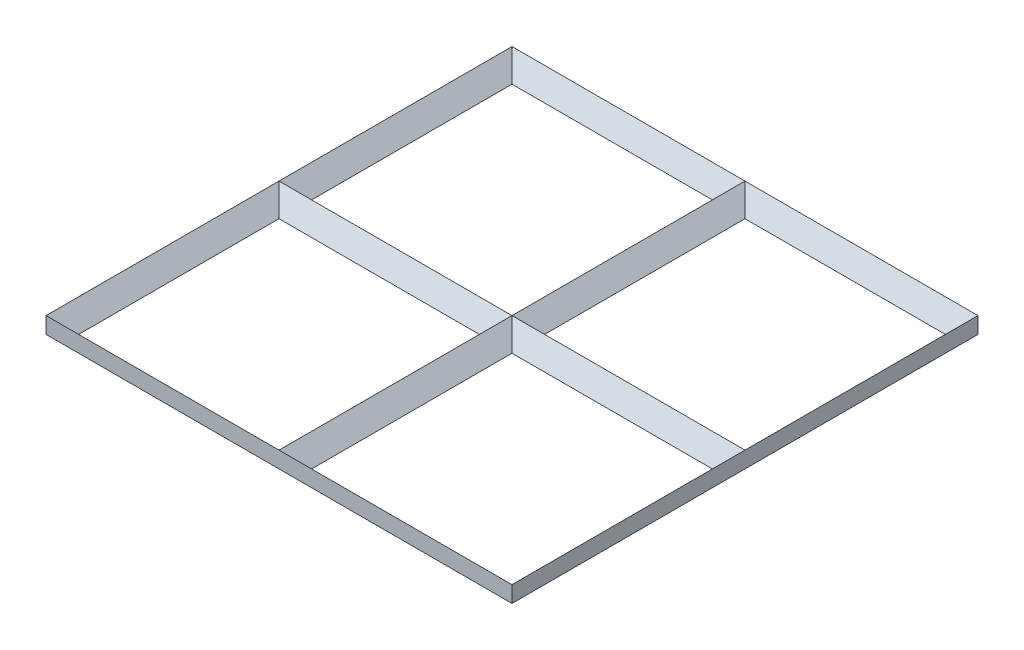
ISO-10303-21;
HEADER;
FILE_DESCRIPTION(('STEP AP214'),'2;1');
FILE_NAME('part.step','',(''),(''),'','','');
FILE_SCHEMA(('AUTOMOTIVE_DESIGN { 1 0 10303 214 1 1 1 1 }'));
ENDSEC;
DATA;
#1=APPLICATION_CONTEXT('core data for automotive mechanical design processes');
#2=APPLICATION_PROTOCOL_DEFINITION('international standard','automotive_design',2000,#1);
#3=PRODUCT_CONTEXT('',#1,'mechanical');
#4=PRODUCT('Part','Part','',(#3));
#5=PRODUCT_RELATED_PRODUCT_CATEGORY('part','',(#4));
#6=PRODUCT_DEFINITION_FORMATION('','',#4);
#7=PRODUCT_DEFINITION_CONTEXT('part definition',#1,'design');
#8=PRODUCT_DEFINITION('design','',#6,#7);
#9=PRODUCT_DEFINITION_SHAPE('','',#8);
#10=(LENGTH_UNIT() NAMED_UNIT(*) SI_UNIT(.MILLI.,.METRE.));
#11=(NAMED_UNIT(*) PLANE_ANGLE_UNIT() SI_UNIT($,.RADIAN.));
#12=(NAMED_UNIT(*) SI_UNIT($,.STERADIAN.) SOLID_ANGLE_UNIT());
#13=UNCERTAINTY_MEASURE_WITH_UNIT(LENGTH_MEASURE(1.E-05),#10,'distance_accuracy_value','');
#14=(GEOMETRIC_REPRESENTATION_CONTEXT(3) GLOBAL_UNCERTAINTY_ASSIGNED_CONTEXT((#13)) GLOBAL_UNIT_ASSIGNED_CONTEXT((#10,
#11,#12)) REPRESENTATION_CONTEXT('',''));
#15=CARTESIAN_POINT('',(0.,0.,0.));
#16=DIRECTION('',(0.,0.,1.));
#17=DIRECTION('',(1.,0.,0.));
#18=AXIS2_PLACEMENT_3D('',#15,#16,#17);
#19=CARTESIAN_POINT('',(100.,3.5,0.));
#20=DIRECTION('',(1.,0.,0.));
#21=DIRECTION('',(0.,0.,-1.));
#22=AXIS2_PLACEMENT_3D('',#19,#20,#21);
#23=PLANE('',#22);
#24=DIRECTION('',(0.,0.,1.));
#25=VECTOR('',#24,1.);
#26=CARTESIAN_POINT('',(100.,0.,0.));
#27=LINE('',#26,#25);
#28=CARTESIAN_POINT('',(100.,0.,-50.));
#29=VERTEX_POINT('',#28);
#30=CARTESIAN_POINT('',(100.,0.,50.));
#31=VERTEX_POINT('',#30);
#32=EDGE_CURVE('E276',#29,#31,#27,.T.);
#33=ORIENTED_EDGE('',*,*,#32,.F.);
#34=DIRECTION('',(0.,-1.,0.));
#35=VECTOR('',#34,1.);
#36=CARTESIAN_POINT('',(100.,3.5,-50.));
#37=LINE('',#36,#35);
#38=CARTESIAN_POINT('',(100.,3.5,-50.));
#39=VERTEX_POINT('',#38);
#40=EDGE_CURVE('E11',#39,#29,#37,.T.);
#41=ORIENTED_EDGE('',*,*,#40,.F.);
#42=DIRECTION('',(0.,0.,1.));
#43=VECTOR('',#42,1.);
#44=CARTESIAN_POINT('',(100.,3.5,0.));
#45=LINE('',#44,#43);
#46=CARTESIAN_POINT('',(100.,3.5,0.));
#47=VERTEX_POINT('',#46);
#48=EDGE_CURVE('E54',#39,#47,#45,.T.);
#49=ORIENTED_EDGE('',*,*,#48,.T.);
#50=DIRECTION('',(0.,0.,1.));
#51=VECTOR('',#50,1.);
#52=CARTESIAN_POINT('',(100.,3.5,50.));
#53=LINE('',#52,#51);
#54=CARTESIAN_POINT('',(100.,3.5,50.));
#55=VERTEX_POINT('',#54);
#56=EDGE_CURVE('E231',#47,#55,#53,.T.);
#57=ORIENTED_EDGE('',*,*,#56,.T.);
#58=DIRECTION('',(0.,-1.,0.));
#59=VECTOR('',#58,1.);
#60=CARTESIAN_POINT('',(100.,3.5,50.));
#61=LINE('',#60,#59);
#62=EDGE_CURVE('E243',#55,#31,#61,.T.);
#63=ORIENTED_EDGE('',*,*,#62,.T.);
#64=EDGE_LOOP('',(#33,#41,#49,#57,#63));
#65=FACE_BOUND('',#64,.T.);
#66=ADVANCED_FACE('F39',(#65),#23,.T.);
#67=CARTESIAN_POINT('',(50.,3.5,-50.));
#68=DIRECTION('',(0.,0.,-1.));
#69=DIRECTION('',(-1.,0.,0.));
#70=AXIS2_PLACEMENT_3D('',#67,#68,#69);
#71=PLANE('',#70);
#72=DIRECTION('',(1.,0.,0.));
#73=VECTOR('',#72,1.);
#74=CARTESIAN_POINT('',(50.,0.,-50.));
#75=LINE('',#74,#73);
#76=CARTESIAN_POINT('',(0.,0.,-50.));
#77=VERTEX_POINT('',#76);
#78=EDGE_CURVE('E266',#77,#29,#75,.T.);
#79=ORIENTED_EDGE('',*,*,#78,.F.);
#80=DIRECTION('',(0.,-1.,0.));
#81=VECTOR('',#80,1.);
#82=CARTESIAN_POINT('',(0.,3.5,-50.));
#83=LINE('',#82,#81);
#84=CARTESIAN_POINT('',(0.,3.5,-50.));
#85=VERTEX_POINT('',#84);
#86=EDGE_CURVE('E207',#85,#77,#83,.T.);
#87=ORIENTED_EDGE('',*,*,#86,.F.);
#88=DIRECTION('',(1.,0.,0.));
#89=VECTOR('',#88,1.);
#90=CARTESIAN_POINT('',(0.,3.5,-50.));
#91=LINE('',#90,#89);
#92=CARTESIAN_POINT('',(50.,3.5,-50.));
#93=VERTEX_POINT('',#92);
#94=EDGE_CURVE('E198',#85,#93,#91,.T.);
#95=ORIENTED_EDGE('',*,*,#94,.T.);
#96=DIRECTION('',(1.,0.,0.));
#97=VECTOR('',#96,1.);
#98=CARTESIAN_POINT('',(50.,3.5,-50.));
#99=LINE('',#98,#97);
#100=EDGE_CURVE('E47',#93,#39,#99,.T.);
#101=ORIENTED_EDGE('',*,*,#100,.T.);
#102=ORIENTED_EDGE('',*,*,#40,.T.);
#103=EDGE_LOOP('',(#79,#87,#95,#101,#102));
#104=FACE_BOUND('',#103,.T.);
#105=ADVANCED_FACE('F284',(#104),#71,.T.);
#106=CARTESIAN_POINT('',(50.,0.,0.));
#107=DIRECTION('',(0.,1.,0.));
#108=DIRECTION('',(0.,0.,1.));
#109=AXIS2_PLACEMENT_3D('',#106,#107,#108);
#110=PLANE('',#109);
#111=DIRECTION('',(1.,0.,0.));
#112=VECTOR('',#111,1.);
#113=CARTESIAN_POINT('',(50.,0.,-3.5));
#114=LINE('',#113,#112);
#115=CARTESIAN_POINT('',(53.5,0.,-3.5));
#116=VERTEX_POINT('',#115);
#117=CARTESIAN_POINT('',(96.5,0.,-3.5));
#118=VERTEX_POINT('',#117);
#119=EDGE_CURVE('E260',#116,#118,#114,.T.);
#120=ORIENTED_EDGE('',*,*,#119,.T.);
#121=DIRECTION('',(0.,0.,1.));
#122=VECTOR('',#121,1.);
#123=CARTESIAN_POINT('',(96.5,0.,0.));
#124=LINE('',#123,#122);
#125=CARTESIAN_POINT('',(96.5,0.,-46.5));
#126=VERTEX_POINT('',#125);
#127=EDGE_CURVE('E274',#126,#118,#124,.T.);
#128=ORIENTED_EDGE('',*,*,#127,.F.);
#129=DIRECTION('',(1.,0.,0.));
#130=VECTOR('',#129,1.);
#131=CARTESIAN_POINT('',(50.,0.,-46.5));
#132=LINE('',#131,#130);
#133=CARTESIAN_POINT('',(53.5,0.,-46.5));
#134=VERTEX_POINT('',#133);
#135=EDGE_CURVE('E272',#134,#126,#132,.T.);
#136=ORIENTED_EDGE('',*,*,#135,.F.);
#137=DIRECTION('',(0.,0.,-1.));
#138=VECTOR('',#137,1.);
#139=CARTESIAN_POINT('',(53.5,0.,0.));
#140=LINE('',#139,#138);
#141=EDGE_CURVE('E65',#116,#134,#140,.T.);
#142=ORIENTED_EDGE('',*,*,#141,.F.);
#143=EDGE_LOOP('',(#120,#128,#136,#142));
#144=FACE_BOUND('',#143,.T.);
#145=ORIENTED_EDGE('',*,*,#32,.T.);
#146=DIRECTION('',(1.,0.,0.));
#147=VECTOR('',#146,1.);
#148=CARTESIAN_POINT('',(50.,0.,50.));
#149=LINE('',#148,#147);
#150=CARTESIAN_POINT('',(0.,0.,50.));
#151=VERTEX_POINT('',#150);
#152=EDGE_CURVE('E235',#151,#31,#149,.T.);
#153=ORIENTED_EDGE('',*,*,#152,.F.);
#154=DIRECTION('',(0.,0.,-1.));
#155=VECTOR('',#154,1.);
#156=CARTESIAN_POINT('',(0.,0.,0.));
#157=LINE('',#156,#155);
#158=EDGE_CURVE('E199',#151,#77,#157,.T.);
#159=ORIENTED_EDGE('',*,*,#158,.T.);
#160=ORIENTED_EDGE('',*,*,#78,.T.);
#161=EDGE_LOOP('',(#145,#153,#159,#160));
#162=FACE_BOUND('',#161,.T.);
#163=DIRECTION('',(1.,0.,0.));
#164=VECTOR('',#163,1.);
#165=CARTESIAN_POINT('',(50.,0.,46.5));
#166=LINE('',#165,#164);
#167=CARTESIAN_POINT('',(53.5,0.,46.5));
#168=VERTEX_POINT('',#167);
#169=CARTESIAN_POINT('',(96.5,0.,46.5));
#170=VERTEX_POINT('',#169);
#171=EDGE_CURVE('E225',#168,#170,#166,.T.);
#172=ORIENTED_EDGE('',*,*,#171,.T.);
#173=DIRECTION('',(0.,0.,1.));
#174=VECTOR('',#173,1.);
#175=CARTESIAN_POINT('',(96.5,0.,50.));
#176=LINE('',#175,#174);
#177=CARTESIAN_POINT('',(96.5,0.,3.5));
#178=VERTEX_POINT('',#177);
#179=EDGE_CURVE('E250',#178,#170,#176,.T.);
#180=ORIENTED_EDGE('',*,*,#179,.F.);
#181=DIRECTION('',(1.,0.,0.));
#182=VECTOR('',#181,1.);
#183=CARTESIAN_POINT('',(50.,0.,3.5));
#184=LINE('',#183,#182);
#185=CARTESIAN_POINT('',(53.5,0.,3.5));
#186=VERTEX_POINT('',#185);
#187=EDGE_CURVE('E248',#186,#178,#184,.T.);
#188=ORIENTED_EDGE('',*,*,#187,.F.);
#189=DIRECTION('',(0.,0.,-1.));
#190=VECTOR('',#189,1.);
#191=CARTESIAN_POINT('',(53.5,0.,50.));
#192=LINE('',#191,#190);
#193=EDGE_CURVE('E246',#168,#186,#192,.T.);
#194=ORIENTED_EDGE('',*,*,#193,.F.);
#195=EDGE_LOOP('',(#172,#180,#188,#194));
#196=FACE_BOUND('',#195,.T.);
#197=DIRECTION('',(1.,0.,0.));
#198=VECTOR('',#197,1.);
#199=CARTESIAN_POINT('',(0.,0.,-3.5));
#200=LINE('',#199,#198);
#201=CARTESIAN_POINT('',(3.5,0.,-3.5));
#202=VERTEX_POINT('',#201);
#203=CARTESIAN_POINT('',(46.5,0.,-3.5));
#204=VERTEX_POINT('',#203);
#205=EDGE_CURVE('E188',#202,#204,#200,.T.);
#206=ORIENTED_EDGE('',*,*,#205,.T.);
#207=DIRECTION('',(0.,0.,1.));
#208=VECTOR('',#207,1.);
#209=CARTESIAN_POINT('',(46.5,0.,0.));
#210=LINE('',#209,#208);
#211=CARTESIAN_POINT('',(46.5,0.,-46.5));
#212=VERTEX_POINT('',#211);
#213=EDGE_CURVE('E215',#212,#204,#210,.T.);
#214=ORIENTED_EDGE('',*,*,#213,.F.);
#215=DIRECTION('',(1.,0.,0.));
#216=VECTOR('',#215,1.);
#217=CARTESIAN_POINT('',(0.,0.,-46.5));
#218=LINE('',#217,#216);
#219=CARTESIAN_POINT('',(3.5,0.,-46.5));
#220=VERTEX_POINT('',#219);
#221=EDGE_CURVE('E212',#220,#212,#218,.T.);
#222=ORIENTED_EDGE('',*,*,#221,.F.);
#223=DIRECTION('',(0.,0.,-1.));
#224=VECTOR('',#223,1.);
#225=CARTESIAN_POINT('',(3.5,0.,0.));
#226=LINE('',#225,#224);
#227=EDGE_CURVE('E210',#202,#220,#226,.T.);
#228=ORIENTED_EDGE('',*,*,#227,.F.);
#229=EDGE_LOOP('',(#206,#214,#222,#228));
#230=FACE_BOUND('',#229,.T.);
#231=DIRECTION('',(1.,0.,0.));
#232=VECTOR('',#231,1.);
#233=CARTESIAN_POINT('',(0.,0.,46.5));
#234=LINE('',#233,#232);
#235=CARTESIAN_POINT('',(3.5,0.,46.5));
#236=VERTEX_POINT('',#235);
#237=CARTESIAN_POINT('',(46.5,0.,46.5));
#238=VERTEX_POINT('',#237);
#239=EDGE_CURVE('E161',#236,#238,#234,.T.);
#240=ORIENTED_EDGE('',*,*,#239,.T.);
#241=DIRECTION('',(0.,0.,1.));
#242=VECTOR('',#241,1.);
#243=CARTESIAN_POINT('',(46.5,0.,50.));
#244=LINE('',#243,#242);
#245=CARTESIAN_POINT('',(46.5,0.,3.5));
#246=VERTEX_POINT('',#245);
#247=EDGE_CURVE('E176',#246,#238,#244,.T.);
#248=ORIENTED_EDGE('',*,*,#247,.F.);
#249=DIRECTION('',(1.,0.,0.));
#250=VECTOR('',#249,1.);
#251=CARTESIAN_POINT('',(0.,0.,3.5));
#252=LINE('',#251,#250);
#253=CARTESIAN_POINT('',(3.5,0.,3.5));
#254=VERTEX_POINT('',#253);
#255=EDGE_CURVE('E174',#254,#246,#252,.T.);
#256=ORIENTED_EDGE('',*,*,#255,.F.);
#257=DIRECTION('',(0.,0.,-1.));
#258=VECTOR('',#257,1.);
#259=CARTESIAN_POINT('',(3.5,0.,50.));
#260=LINE('',#259,#258);
#261=EDGE_CURVE('E155',#236,#254,#260,.T.);
#262=ORIENTED_EDGE('',*,*,#261,.F.);
#263=EDGE_LOOP('',(#240,#248,#256,#262));
#264=FACE_BOUND('',#263,.T.);
#265=ADVANCED_FACE('F172',(#144,#162,#196,#230,#264),#110,.F.);
#266=CARTESIAN_POINT('',(53.5,0.,0.));
#267=DIRECTION('',(-0.707106781186546,-0.707106781186549,0.));
#268=DIRECTION('',(0.707106781186549,-0.707106781186546,0.));
#269=AXIS2_PLACEMENT_3D('',#266,#267,#268);
#270=PLANE('',#269);
#271=ORIENTED_EDGE('',*,*,#141,.T.);
#272=DIRECTION('',(0.577350269189627,-0.577350269189624,0.577350269189627));
#273=VECTOR('',#272,1.);
#274=CARTESIAN_POINT('',(69.,-15.5,-31.));
#275=LINE('',#274,#273);
#276=EDGE_CURVE('E257',#93,#134,#275,.T.);
#277=ORIENTED_EDGE('',*,*,#276,.F.);
#278=DIRECTION('',(0.,0.,1.));
#279=VECTOR('',#278,1.);
#280=CARTESIAN_POINT('',(50.,3.5,0.));
#281=LINE('',#280,#279);
#282=CARTESIAN_POINT('',(50.,3.5,0.));
#283=VERTEX_POINT('',#282);
#284=EDGE_CURVE('E195',#93,#283,#281,.T.);
#285=ORIENTED_EDGE('',*,*,#284,.T.);
#286=DIRECTION('',(-0.577350269189627,0.577350269189624,0.577350269189627));
#287=VECTOR('',#286,1.);
#288=CARTESIAN_POINT('',(52.3333333333333,1.16666666666667,-2.33333333333333));
#289=LINE('',#288,#287);
#290=EDGE_CURVE('E258',#283,#116,#289,.F.);
#291=ORIENTED_EDGE('',*,*,#290,.T.);
#292=EDGE_LOOP('',(#271,#277,#285,#291));
#293=FACE_BOUND('',#292,.T.);
#294=ADVANCED_FACE('F334',(#293),#270,.F.);
#295=CARTESIAN_POINT('',(50.,0.,-3.5));
#296=DIRECTION('',(0.,-0.707106781186549,0.707106781186546));
#297=DIRECTION('',(0.,-0.707106781186546,-0.707106781186549));
#298=AXIS2_PLACEMENT_3D('',#295,#296,#297);
#299=PLANE('',#298);
#300=ORIENTED_EDGE('',*,*,#119,.F.);
#301=ORIENTED_EDGE('',*,*,#290,.F.);
#302=DIRECTION('',(1.,0.,0.));
#303=VECTOR('',#302,1.);
#304=CARTESIAN_POINT('',(50.,3.5,0.));
#305=LINE('',#304,#303);
#306=EDGE_CURVE('E234',#283,#47,#305,.T.);
#307=ORIENTED_EDGE('',*,*,#306,.T.);
#308=DIRECTION('',(0.577350269189627,0.577350269189624,0.577350269189627));
#309=VECTOR('',#308,1.);
#310=CARTESIAN_POINT('',(81.,-15.5,-19.));
#311=LINE('',#310,#309);
#312=EDGE_CURVE('E261',#47,#118,#311,.F.);
#313=ORIENTED_EDGE('',*,*,#312,.T.);
#314=EDGE_LOOP('',(#300,#301,#307,#313));
#315=FACE_BOUND('',#314,.T.);
#316=ADVANCED_FACE('F333',(#315),#299,.F.);
#317=CARTESIAN_POINT('',(96.5,0.,0.));
#318=DIRECTION('',(0.707106781186546,-0.707106781186549,0.));
#319=DIRECTION('',(0.707106781186549,0.707106781186546,0.));
#320=AXIS2_PLACEMENT_3D('',#317,#318,#319);
#321=PLANE('',#320);
#322=ORIENTED_EDGE('',*,*,#127,.T.);
#323=ORIENTED_EDGE('',*,*,#312,.F.);
#324=ORIENTED_EDGE('',*,*,#48,.F.);
#325=DIRECTION('',(-0.577350269189626,-0.577350269189624,0.577350269189627));
#326=VECTOR('',#325,1.);
#327=CARTESIAN_POINT('',(81.,-15.5,-31.));
#328=LINE('',#327,#326);
#329=EDGE_CURVE('E77',#39,#126,#328,.T.);
#330=ORIENTED_EDGE('',*,*,#329,.T.);
#331=EDGE_LOOP('',(#322,#323,#324,#330));
#332=FACE_BOUND('',#331,.T.);
#333=ADVANCED_FACE('F392',(#332),#321,.F.);
#334=CARTESIAN_POINT('',(50.,0.,-46.5));
#335=DIRECTION('',(0.,-0.707106781186549,-0.707106781186546));
#336=DIRECTION('',(0.,0.707106781186546,-0.707106781186549));
#337=AXIS2_PLACEMENT_3D('',#334,#335,#336);
#338=PLANE('',#337);
#339=ORIENTED_EDGE('',*,*,#135,.T.);
#340=ORIENTED_EDGE('',*,*,#329,.F.);
#341=ORIENTED_EDGE('',*,*,#100,.F.);
#342=ORIENTED_EDGE('',*,*,#276,.T.);
#343=EDGE_LOOP('',(#339,#340,#341,#342));
#344=FACE_BOUND('',#343,.T.);
#345=ADVANCED_FACE('F338',(#344),#338,.F.);
#346=CARTESIAN_POINT('',(50.,3.5,50.));
#347=DIRECTION('',(0.,0.,-1.));
#348=DIRECTION('',(-1.,0.,0.));
#349=AXIS2_PLACEMENT_3D('',#346,#347,#348);
#350=PLANE('',#349);
#351=ORIENTED_EDGE('',*,*,#152,.T.);
#352=ORIENTED_EDGE('',*,*,#62,.F.);
#353=DIRECTION('',(1.,0.,0.));
#354=VECTOR('',#353,1.);
#355=CARTESIAN_POINT('',(50.,3.5,50.));
#356=LINE('',#355,#354);
#357=CARTESIAN_POINT('',(50.,3.5,50.));
#358=VERTEX_POINT('',#357);
#359=EDGE_CURVE('E241',#358,#55,#356,.T.);
#360=ORIENTED_EDGE('',*,*,#359,.F.);
#361=DIRECTION('',(1.,0.,0.));
#362=VECTOR('',#361,1.);
#363=CARTESIAN_POINT('',(0.,3.5,50.));
#364=LINE('',#363,#362);
#365=CARTESIAN_POINT('',(0.,3.5,50.));
#366=VERTEX_POINT('',#365);
#367=EDGE_CURVE('E185',#366,#358,#364,.T.);
#368=ORIENTED_EDGE('',*,*,#367,.F.);
#369=DIRECTION('',(0.,-1.,0.));
#370=VECTOR('',#369,1.);
#371=CARTESIAN_POINT('',(0.,3.5,50.));
#372=LINE('',#371,#370);
#373=EDGE_CURVE('E181',#366,#151,#372,.T.);
#374=ORIENTED_EDGE('',*,*,#373,.T.);
#375=EDGE_LOOP('',(#351,#352,#360,#368,#374));
#376=FACE_BOUND('',#375,.T.);
#377=ADVANCED_FACE('F319',(#376),#350,.F.);
#378=CARTESIAN_POINT('',(53.5,0.,50.));
#379=DIRECTION('',(-0.707106781186546,-0.707106781186549,0.));
#380=DIRECTION('',(0.707106781186549,-0.707106781186546,0.));
#381=AXIS2_PLACEMENT_3D('',#378,#379,#380);
#382=PLANE('',#381);
#383=ORIENTED_EDGE('',*,*,#193,.T.);
#384=DIRECTION('',(0.577350269189627,-0.577350269189624,0.577350269189627));
#385=VECTOR('',#384,1.);
#386=CARTESIAN_POINT('',(69.,-15.5,19.));
#387=LINE('',#386,#385);
#388=EDGE_CURVE('E222',#283,#186,#387,.T.);
#389=ORIENTED_EDGE('',*,*,#388,.F.);
#390=DIRECTION('',(0.,0.,-1.));
#391=VECTOR('',#390,1.);
#392=CARTESIAN_POINT('',(50.,3.5,50.));
#393=LINE('',#392,#391);
#394=EDGE_CURVE('E238',#358,#283,#393,.T.);
#395=ORIENTED_EDGE('',*,*,#394,.F.);
#396=DIRECTION('',(-0.577350269189627,0.577350269189624,0.577350269189627));
#397=VECTOR('',#396,1.);
#398=CARTESIAN_POINT('',(52.3333333333333,1.16666666666667,47.6666666666667));
#399=LINE('',#398,#397);
#400=EDGE_CURVE('E223',#358,#168,#399,.F.);
#401=ORIENTED_EDGE('',*,*,#400,.T.);
#402=EDGE_LOOP('',(#383,#389,#395,#401));
#403=FACE_BOUND('',#402,.T.);
#404=ADVANCED_FACE('F314',(#403),#382,.F.);
#405=CARTESIAN_POINT('',(50.,0.,46.5));
#406=DIRECTION('',(0.,-0.707106781186549,0.707106781186546));
#407=DIRECTION('',(0.,-0.707106781186546,-0.707106781186549));
#408=AXIS2_PLACEMENT_3D('',#405,#406,#407);
#409=PLANE('',#408);
#410=ORIENTED_EDGE('',*,*,#171,.F.);
#411=ORIENTED_EDGE('',*,*,#400,.F.);
#412=ORIENTED_EDGE('',*,*,#359,.T.);
#413=DIRECTION('',(0.577350269189627,0.577350269189624,0.577350269189627));
#414=VECTOR('',#413,1.);
#415=CARTESIAN_POINT('',(81.,-15.5,31.));
#416=LINE('',#415,#414);
#417=EDGE_CURVE('E226',#55,#170,#416,.F.);
#418=ORIENTED_EDGE('',*,*,#417,.T.);
#419=EDGE_LOOP('',(#410,#411,#412,#418));
#420=FACE_BOUND('',#419,.T.);
#421=ADVANCED_FACE('F322',(#420),#409,.F.);
#422=CARTESIAN_POINT('',(96.5,0.,50.));
#423=DIRECTION('',(0.707106781186546,-0.707106781186549,0.));
#424=DIRECTION('',(0.707106781186549,0.707106781186546,0.));
#425=AXIS2_PLACEMENT_3D('',#422,#423,#424);
#426=PLANE('',#425);
#427=ORIENTED_EDGE('',*,*,#179,.T.);
#428=ORIENTED_EDGE('',*,*,#417,.F.);
#429=ORIENTED_EDGE('',*,*,#56,.F.);
#430=DIRECTION('',(-0.577350269189626,-0.577350269189624,0.577350269189627));
#431=VECTOR('',#430,1.);
#432=CARTESIAN_POINT('',(81.,-15.5,19.));
#433=LINE('',#432,#431);
#434=EDGE_CURVE('E73',#47,#178,#433,.T.);
#435=ORIENTED_EDGE('',*,*,#434,.T.);
#436=EDGE_LOOP('',(#427,#428,#429,#435));
#437=FACE_BOUND('',#436,.T.);
#438=ADVANCED_FACE('F324',(#437),#426,.F.);
#439=CARTESIAN_POINT('',(50.,0.,3.5));
#440=DIRECTION('',(0.,-0.707106781186549,-0.707106781186546));
#441=DIRECTION('',(0.,0.707106781186546,-0.707106781186549));
#442=AXIS2_PLACEMENT_3D('',#439,#440,#441);
#443=PLANE('',#442);
#444=ORIENTED_EDGE('',*,*,#187,.T.);
#445=ORIENTED_EDGE('',*,*,#434,.F.);
#446=ORIENTED_EDGE('',*,*,#306,.F.);
#447=ORIENTED_EDGE('',*,*,#388,.T.);
#448=EDGE_LOOP('',(#444,#445,#446,#447));
#449=FACE_BOUND('',#448,.T.);
#450=ADVANCED_FACE('F329',(#449),#443,.F.);
#451=CARTESIAN_POINT('',(0.,3.5,0.));
#452=DIRECTION('',(-1.,0.,0.));
#453=DIRECTION('',(0.,0.,1.));
#454=AXIS2_PLACEMENT_3D('',#451,#452,#453);
#455=PLANE('',#454);
#456=ORIENTED_EDGE('',*,*,#158,.F.);
#457=ORIENTED_EDGE('',*,*,#373,.F.);
#458=DIRECTION('',(0.,0.,-1.));
#459=VECTOR('',#458,1.);
#460=CARTESIAN_POINT('',(0.,3.5,50.));
#461=LINE('',#460,#459);
#462=CARTESIAN_POINT('',(0.,3.5,0.));
#463=VERTEX_POINT('',#462);
#464=EDGE_CURVE('E158',#366,#463,#461,.T.);
#465=ORIENTED_EDGE('',*,*,#464,.T.);
#466=DIRECTION('',(0.,0.,-1.));
#467=VECTOR('',#466,1.);
#468=CARTESIAN_POINT('',(0.,3.5,0.));
#469=LINE('',#468,#467);
#470=EDGE_CURVE('E202',#463,#85,#469,.T.);
#471=ORIENTED_EDGE('',*,*,#470,.T.);
#472=ORIENTED_EDGE('',*,*,#86,.T.);
#473=EDGE_LOOP('',(#456,#457,#465,#471,#472));
#474=FACE_BOUND('',#473,.T.);
#475=ADVANCED_FACE('F287',(#474),#455,.T.);
#476=CARTESIAN_POINT('',(3.5,0.,0.));
#477=DIRECTION('',(-0.707106781186546,-0.707106781186549,0.));
#478=DIRECTION('',(0.707106781186549,-0.707106781186546,0.));
#479=AXIS2_PLACEMENT_3D('',#476,#477,#478);
#480=PLANE('',#479);
#481=ORIENTED_EDGE('',*,*,#227,.T.);
#482=DIRECTION('',(0.577350269189627,-0.577350269189624,0.577350269189627));
#483=VECTOR('',#482,1.);
#484=CARTESIAN_POINT('',(19.,-15.5,-31.));
#485=LINE('',#484,#483);
#486=EDGE_CURVE('E184',#85,#220,#485,.T.);
#487=ORIENTED_EDGE('',*,*,#486,.F.);
#488=ORIENTED_EDGE('',*,*,#470,.F.);
#489=DIRECTION('',(-0.577350269189627,0.577350269189624,0.577350269189627));
#490=VECTOR('',#489,1.);
#491=CARTESIAN_POINT('',(2.33333333333333,1.16666666666667,-2.33333333333333));
#492=LINE('',#491,#490);
#493=EDGE_CURVE('E186',#463,#202,#492,.F.);
#494=ORIENTED_EDGE('',*,*,#493,.T.);
#495=EDGE_LOOP('',(#481,#487,#488,#494));
#496=FACE_BOUND('',#495,.T.);
#497=ADVANCED_FACE('F290',(#496),#480,.F.);
#498=CARTESIAN_POINT('',(0.,0.,-3.5));
#499=DIRECTION('',(0.,-0.707106781186549,0.707106781186546));
#500=DIRECTION('',(0.,-0.707106781186546,-0.707106781186549));
#501=AXIS2_PLACEMENT_3D('',#498,#499,#500);
#502=PLANE('',#501);
#503=ORIENTED_EDGE('',*,*,#205,.F.);
#504=ORIENTED_EDGE('',*,*,#493,.F.);
#505=DIRECTION('',(1.,0.,0.));
#506=VECTOR('',#505,1.);
#507=CARTESIAN_POINT('',(0.,3.5,0.));
#508=LINE('',#507,#506);
#509=EDGE_CURVE('E205',#463,#283,#508,.T.);
#510=ORIENTED_EDGE('',*,*,#509,.T.);
#511=DIRECTION('',(0.577350269189627,0.577350269189624,0.577350269189627));
#512=VECTOR('',#511,1.);
#513=CARTESIAN_POINT('',(31.,-15.5,-19.));
#514=LINE('',#513,#512);
#515=EDGE_CURVE('E189',#283,#204,#514,.F.);
#516=ORIENTED_EDGE('',*,*,#515,.T.);
#517=EDGE_LOOP('',(#503,#504,#510,#516));
#518=FACE_BOUND('',#517,.T.);
#519=ADVANCED_FACE('F303',(#518),#502,.F.);
#520=CARTESIAN_POINT('',(46.5,0.,0.));
#521=DIRECTION('',(0.707106781186546,-0.707106781186549,0.));
#522=DIRECTION('',(0.707106781186549,0.707106781186546,0.));
#523=AXIS2_PLACEMENT_3D('',#520,#521,#522);
#524=PLANE('',#523);
#525=ORIENTED_EDGE('',*,*,#213,.T.);
#526=ORIENTED_EDGE('',*,*,#515,.F.);
#527=ORIENTED_EDGE('',*,*,#284,.F.);
#528=DIRECTION('',(-0.577350269189626,-0.577350269189624,0.577350269189627));
#529=VECTOR('',#528,1.);
#530=CARTESIAN_POINT('',(31.,-15.5,-31.));
#531=LINE('',#530,#529);
#532=EDGE_CURVE('E192',#93,#212,#531,.T.);
#533=ORIENTED_EDGE('',*,*,#532,.T.);
#534=EDGE_LOOP('',(#525,#526,#527,#533));
#535=FACE_BOUND('',#534,.T.);
#536=ADVANCED_FACE('F305',(#535),#524,.F.);
#537=CARTESIAN_POINT('',(0.,0.,-46.5));
#538=DIRECTION('',(0.,-0.707106781186549,-0.707106781186546));
#539=DIRECTION('',(0.,0.707106781186546,-0.707106781186549));
#540=AXIS2_PLACEMENT_3D('',#537,#538,#539);
#541=PLANE('',#540);
#542=ORIENTED_EDGE('',*,*,#221,.T.);
#543=ORIENTED_EDGE('',*,*,#532,.F.);
#544=ORIENTED_EDGE('',*,*,#94,.F.);
#545=ORIENTED_EDGE('',*,*,#486,.T.);
#546=EDGE_LOOP('',(#542,#543,#544,#545));
#547=FACE_BOUND('',#546,.T.);
#548=ADVANCED_FACE('F340',(#547),#541,.F.);
#549=CARTESIAN_POINT('',(3.5,0.,50.));
#550=DIRECTION('',(-0.707106781186546,-0.707106781186549,0.));
#551=DIRECTION('',(0.707106781186549,-0.707106781186546,0.));
#552=AXIS2_PLACEMENT_3D('',#549,#550,#551);
#553=PLANE('',#552);
#554=ORIENTED_EDGE('',*,*,#261,.T.);
#555=DIRECTION('',(0.577350269189627,-0.577350269189624,0.577350269189627));
#556=VECTOR('',#555,1.);
#557=CARTESIAN_POINT('',(19.,-15.5,19.));
#558=LINE('',#557,#556);
#559=EDGE_CURVE('E293',#463,#254,#558,.T.);
#560=ORIENTED_EDGE('',*,*,#559,.F.);
#561=ORIENTED_EDGE('',*,*,#464,.F.);
#562=DIRECTION('',(-0.577350269189627,0.577350269189624,0.577350269189627));
#563=VECTOR('',#562,1.);
#564=CARTESIAN_POINT('',(2.33333333333333,1.16666666666667,47.6666666666667));
#565=LINE('',#564,#563);
#566=EDGE_CURVE('E150',#366,#236,#565,.F.);
#567=ORIENTED_EDGE('',*,*,#566,.T.);
#568=EDGE_LOOP('',(#554,#560,#561,#567));
#569=FACE_BOUND('',#568,.T.);
#570=ADVANCED_FACE('F152',(#569),#553,.F.);
#571=CARTESIAN_POINT('',(0.,0.,46.5));
#572=DIRECTION('',(0.,-0.707106781186549,0.707106781186546));
#573=DIRECTION('',(0.,-0.707106781186546,-0.707106781186549));
#574=AXIS2_PLACEMENT_3D('',#571,#572,#573);
#575=PLANE('',#574);
#576=ORIENTED_EDGE('',*,*,#239,.F.);
#577=ORIENTED_EDGE('',*,*,#566,.F.);
#578=ORIENTED_EDGE('',*,*,#367,.T.);
#579=DIRECTION('',(0.577350269189627,0.577350269189624,0.577350269189627));
#580=VECTOR('',#579,1.);
#581=CARTESIAN_POINT('',(31.,-15.5,31.));
#582=LINE('',#581,#580);
#583=EDGE_CURVE('E162',#358,#238,#582,.F.);
#584=ORIENTED_EDGE('',*,*,#583,.T.);
#585=EDGE_LOOP('',(#576,#577,#578,#584));
#586=FACE_BOUND('',#585,.T.);
#587=ADVANCED_FACE('F165',(#586),#575,.F.);
#588=CARTESIAN_POINT('',(46.5,0.,50.));
#589=DIRECTION('',(0.707106781186546,-0.707106781186549,0.));
#590=DIRECTION('',(0.707106781186549,0.707106781186546,0.));
#591=AXIS2_PLACEMENT_3D('',#588,#589,#590);
#592=PLANE('',#591);
#593=ORIENTED_EDGE('',*,*,#247,.T.);
#594=ORIENTED_EDGE('',*,*,#583,.F.);
#595=ORIENTED_EDGE('',*,*,#394,.T.);
#596=DIRECTION('',(-0.577350269189626,-0.577350269189624,0.577350269189627));
#597=VECTOR('',#596,1.);
#598=CARTESIAN_POINT('',(31.,-15.5,19.));
#599=LINE('',#598,#597);
#600=EDGE_CURVE('E296',#283,#246,#599,.T.);
#601=ORIENTED_EDGE('',*,*,#600,.T.);
#602=EDGE_LOOP('',(#593,#594,#595,#601));
#603=FACE_BOUND('',#602,.T.);
#604=ADVANCED_FACE('F310',(#603),#592,.F.);
#605=CARTESIAN_POINT('',(0.,0.,3.5));
#606=DIRECTION('',(0.,-0.707106781186549,-0.707106781186546));
#607=DIRECTION('',(0.,0.707106781186546,-0.707106781186549));
#608=AXIS2_PLACEMENT_3D('',#605,#606,#607);
#609=PLANE('',#608);
#610=ORIENTED_EDGE('',*,*,#255,.T.);
#611=ORIENTED_EDGE('',*,*,#600,.F.);
#612=ORIENTED_EDGE('',*,*,#509,.F.);
#613=ORIENTED_EDGE('',*,*,#559,.T.);
#614=EDGE_LOOP('',(#610,#611,#612,#613));
#615=FACE_BOUND('',#614,.T.);
#616=ADVANCED_FACE('F299',(#615),#609,.F.);
#617=CLOSED_SHELL('',(#66,#105,#265,#294,#316,#333,#345,#377,#404,#421,#438,#450,#475,#497,#519,
#536,#548,#570,#587,#604,#616));
#618=MANIFOLD_SOLID_BREP('B2',#617);
#619=ADVANCED_BREP_SHAPE_REPRESENTATION('',(#18,#618),#14);
#620=SHAPE_DEFINITION_REPRESENTATION(#9,#619);
ENDSEC;
END-ISO-10303-21;
